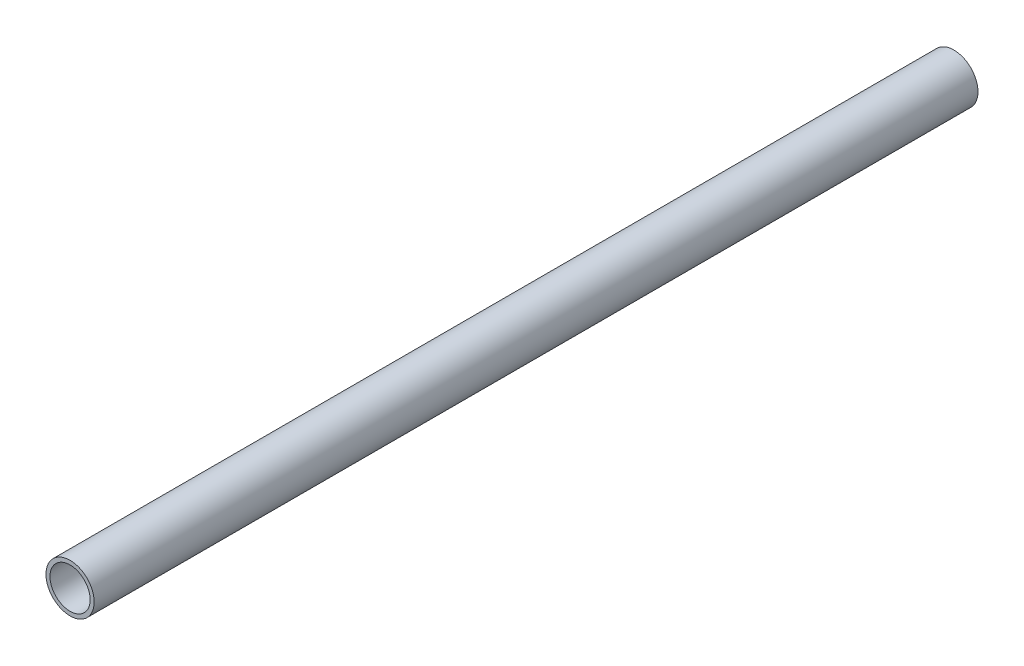
ISO-10303-21;
HEADER;
FILE_DESCRIPTION(('STEP AP214'),'2;1');
FILE_NAME('part.step','',(''),(''),'','','');
FILE_SCHEMA(('AUTOMOTIVE_DESIGN { 1 0 10303 214 1 1 1 1 }'));
ENDSEC;
DATA;
#1=APPLICATION_CONTEXT('core data for automotive mechanical design processes');
#2=APPLICATION_PROTOCOL_DEFINITION('international standard','automotive_design',2000,#1);
#3=PRODUCT_CONTEXT('',#1,'mechanical');
#4=PRODUCT('Part','Part','',(#3));
#5=PRODUCT_RELATED_PRODUCT_CATEGORY('part','',(#4));
#6=PRODUCT_DEFINITION_FORMATION('','',#4);
#7=PRODUCT_DEFINITION_CONTEXT('part definition',#1,'design');
#8=PRODUCT_DEFINITION('design','',#6,#7);
#9=PRODUCT_DEFINITION_SHAPE('','',#8);
#10=(LENGTH_UNIT() NAMED_UNIT(*) SI_UNIT(.MILLI.,.METRE.));
#11=(NAMED_UNIT(*) PLANE_ANGLE_UNIT() SI_UNIT($,.RADIAN.));
#12=(NAMED_UNIT(*) SI_UNIT($,.STERADIAN.) SOLID_ANGLE_UNIT());
#13=UNCERTAINTY_MEASURE_WITH_UNIT(LENGTH_MEASURE(1.E-05),#10,'distance_accuracy_value','');
#14=(GEOMETRIC_REPRESENTATION_CONTEXT(3) GLOBAL_UNCERTAINTY_ASSIGNED_CONTEXT((#13)) GLOBAL_UNIT_ASSIGNED_CONTEXT((#10,
#11,#12)) REPRESENTATION_CONTEXT('',''));
#15=CARTESIAN_POINT('',(0.,0.,0.));
#16=DIRECTION('',(0.,0.,1.));
#17=DIRECTION('',(1.,0.,0.));
#18=AXIS2_PLACEMENT_3D('',#15,#16,#17);
#19=CARTESIAN_POINT('',(0.,0.,220.));
#20=DIRECTION('',(0.,0.,1.));
#21=DIRECTION('',(1.,0.,0.));
#22=AXIS2_PLACEMENT_3D('',#19,#20,#21);
#23=PLANE('',#22);
#24=CARTESIAN_POINT('',(0.,0.,220.));
#25=DIRECTION('',(0.,0.,1.));
#26=DIRECTION('',(1.,0.,0.));
#27=AXIS2_PLACEMENT_3D('',#24,#25,#26);
#28=CIRCLE('',#27,6.);
#29=CARTESIAN_POINT('',(6.,0.,220.));
#30=VERTEX_POINT('',#29);
#31=EDGE_CURVE('E10',#30,#30,#28,.T.);
#32=ORIENTED_EDGE('',*,*,#31,.T.);
#33=EDGE_LOOP('',(#32));
#34=FACE_BOUND('',#33,.T.);
#35=CARTESIAN_POINT('',(0.,0.,220.));
#36=DIRECTION('',(0.,0.,1.));
#37=DIRECTION('',(1.,0.,0.));
#38=AXIS2_PLACEMENT_3D('',#35,#36,#37);
#39=CIRCLE('',#38,5.);
#40=CARTESIAN_POINT('',(5.,0.,220.));
#41=VERTEX_POINT('',#40);
#42=EDGE_CURVE('E42',#41,#41,#39,.T.);
#43=ORIENTED_EDGE('',*,*,#42,.F.);
#44=EDGE_LOOP('',(#43));
#45=FACE_BOUND('',#44,.T.);
#46=ADVANCED_FACE('F31',(#34,#45),#23,.T.);
#47=CARTESIAN_POINT('',(0.,0.,0.));
#48=DIRECTION('',(0.,0.,1.));
#49=DIRECTION('',(1.,0.,0.));
#50=AXIS2_PLACEMENT_3D('',#47,#48,#49);
#51=PLANE('',#50);
#52=CARTESIAN_POINT('',(0.,0.,0.));
#53=DIRECTION('',(0.,0.,1.));
#54=DIRECTION('',(1.,0.,0.));
#55=AXIS2_PLACEMENT_3D('',#52,#53,#54);
#56=CIRCLE('',#55,6.);
#57=CARTESIAN_POINT('',(6.,0.,0.));
#58=VERTEX_POINT('',#57);
#59=EDGE_CURVE('E35',#58,#58,#56,.T.);
#60=ORIENTED_EDGE('',*,*,#59,.F.);
#61=EDGE_LOOP('',(#60));
#62=FACE_BOUND('',#61,.T.);
#63=CARTESIAN_POINT('',(0.,0.,0.));
#64=DIRECTION('',(0.,0.,1.));
#65=DIRECTION('',(1.,0.,0.));
#66=AXIS2_PLACEMENT_3D('',#63,#64,#65);
#67=CIRCLE('',#66,5.);
#68=CARTESIAN_POINT('',(5.,0.,0.));
#69=VERTEX_POINT('',#68);
#70=EDGE_CURVE('E44',#69,#69,#67,.T.);
#71=ORIENTED_EDGE('',*,*,#70,.T.);
#72=EDGE_LOOP('',(#71));
#73=FACE_BOUND('',#72,.T.);
#74=ADVANCED_FACE('F54',(#62,#73),#51,.F.);
#75=CARTESIAN_POINT('',(0.,0.,220.));
#76=DIRECTION('',(0.,0.,-1.));
#77=DIRECTION('',(-1.,0.,0.));
#78=AXIS2_PLACEMENT_3D('',#75,#76,#77);
#79=CYLINDRICAL_SURFACE('',#78,6.);
#80=ORIENTED_EDGE('',*,*,#31,.F.);
#81=EDGE_LOOP('',(#80));
#82=FACE_BOUND('',#81,.T.);
#83=ORIENTED_EDGE('',*,*,#59,.T.);
#84=EDGE_LOOP('',(#83));
#85=FACE_BOUND('',#84,.T.);
#86=ADVANCED_FACE('F33',(#82,#85),#79,.T.);
#87=CARTESIAN_POINT('',(0.,0.,220.));
#88=DIRECTION('',(0.,0.,-1.));
#89=DIRECTION('',(-1.,0.,0.));
#90=AXIS2_PLACEMENT_3D('',#87,#88,#89);
#91=CYLINDRICAL_SURFACE('',#90,5.);
#92=ORIENTED_EDGE('',*,*,#42,.T.);
#93=EDGE_LOOP('',(#92));
#94=FACE_BOUND('',#93,.T.);
#95=ORIENTED_EDGE('',*,*,#70,.F.);
#96=EDGE_LOOP('',(#95));
#97=FACE_BOUND('',#96,.T.);
#98=ADVANCED_FACE('F50',(#94,#97),#91,.F.);
#99=CLOSED_SHELL('',(#46,#74,#86,#98));
#100=MANIFOLD_SOLID_BREP('B2',#99);
#101=ADVANCED_BREP_SHAPE_REPRESENTATION('',(#18,#100),#14);
#102=SHAPE_DEFINITION_REPRESENTATION(#9,#101);
ENDSEC;
END-ISO-10303-21;
